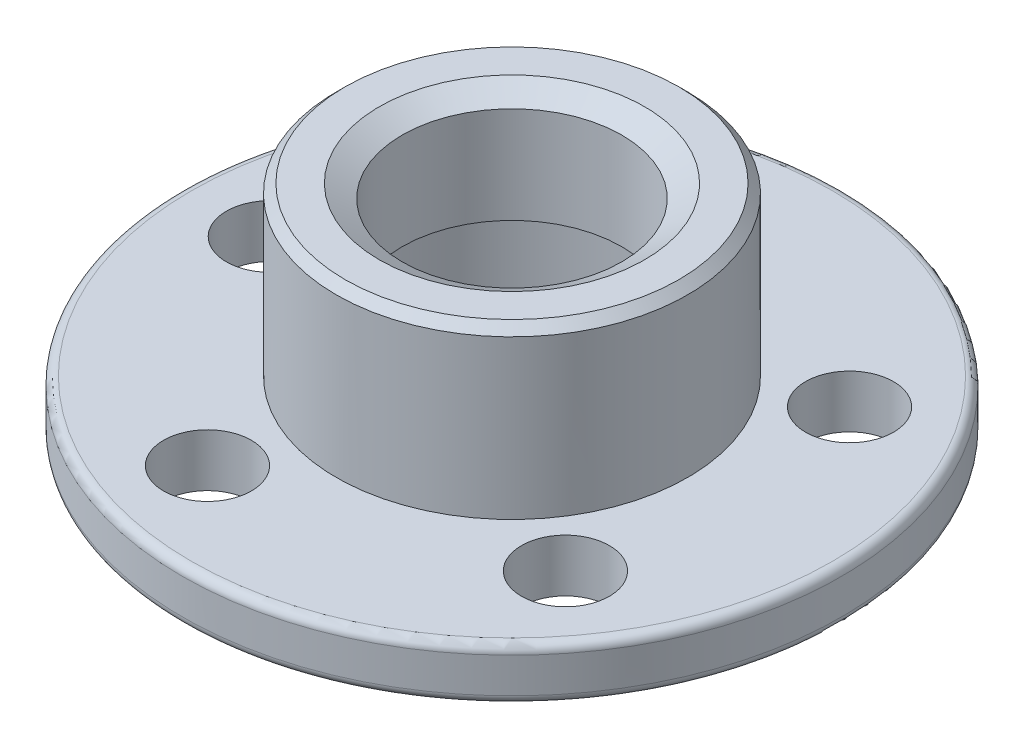
ISO-10303-21;
HEADER;
FILE_DESCRIPTION(('STEP AP214'),'2;1');
FILE_NAME('part.step','',(''),(''),'','','');
FILE_SCHEMA(('AUTOMOTIVE_DESIGN { 1 0 10303 214 1 1 1 1 }'));
ENDSEC;
DATA;
#1=APPLICATION_CONTEXT('core data for automotive mechanical design processes');
#2=APPLICATION_PROTOCOL_DEFINITION('international standard','automotive_design',2000,#1);
#3=PRODUCT_CONTEXT('',#1,'mechanical');
#4=PRODUCT('Part','Part','',(#3));
#5=PRODUCT_RELATED_PRODUCT_CATEGORY('part','',(#4));
#6=PRODUCT_DEFINITION_FORMATION('','',#4);
#7=PRODUCT_DEFINITION_CONTEXT('part definition',#1,'design');
#8=PRODUCT_DEFINITION('design','',#6,#7);
#9=PRODUCT_DEFINITION_SHAPE('','',#8);
#10=(LENGTH_UNIT() NAMED_UNIT(*) SI_UNIT(.MILLI.,.METRE.));
#11=(NAMED_UNIT(*) PLANE_ANGLE_UNIT() SI_UNIT($,.RADIAN.));
#12=(NAMED_UNIT(*) SI_UNIT($,.STERADIAN.) SOLID_ANGLE_UNIT());
#13=UNCERTAINTY_MEASURE_WITH_UNIT(LENGTH_MEASURE(1.E-05),#10,'distance_accuracy_value','');
#14=(GEOMETRIC_REPRESENTATION_CONTEXT(3) GLOBAL_UNCERTAINTY_ASSIGNED_CONTEXT((#13)) GLOBAL_UNIT_ASSIGNED_CONTEXT((#10,
#11,#12)) REPRESENTATION_CONTEXT('',''));
#15=CARTESIAN_POINT('',(0.,0.,0.));
#16=DIRECTION('',(0.,0.,1.));
#17=DIRECTION('',(1.,0.,0.));
#18=AXIS2_PLACEMENT_3D('',#15,#16,#17);
#19=CARTESIAN_POINT('',(0.,0.,0.));
#20=DIRECTION('',(0.,-1.,0.));
#21=DIRECTION('',(0.,0.,-1.));
#22=AXIS2_PLACEMENT_3D('',#19,#20,#21);
#23=CYLINDRICAL_SURFACE('',#22,35.);
#24=CARTESIAN_POINT('',(0.,0.,0.));
#25=DIRECTION('',(0.,-1.,0.));
#26=DIRECTION('',(0.,0.,-1.));
#27=AXIS2_PLACEMENT_3D('',#24,#25,#26);
#28=CIRCLE('',#27,35.);
#29=CARTESIAN_POINT('',(0.,0.,-35.));
#30=VERTEX_POINT('',#29);
#31=EDGE_CURVE('E80',#30,#30,#28,.T.);
#32=ORIENTED_EDGE('',*,*,#31,.T.);
#33=EDGE_LOOP('',(#32));
#34=FACE_BOUND('',#33,.T.);
#35=CARTESIAN_POINT('',(0.,25.,0.));
#36=DIRECTION('',(0.,-1.,0.));
#37=DIRECTION('',(0.,0.,-1.));
#38=AXIS2_PLACEMENT_3D('',#35,#36,#37);
#39=CIRCLE('',#38,35.);
#40=CARTESIAN_POINT('',(0.,25.,-35.));
#41=VERTEX_POINT('',#40);
#42=EDGE_CURVE('E92',#41,#41,#39,.T.);
#43=ORIENTED_EDGE('',*,*,#42,.F.);
#44=EDGE_LOOP('',(#43));
#45=FACE_BOUND('',#44,.T.);
#46=ADVANCED_FACE('F39',(#34,#45),#23,.F.);
#47=CARTESIAN_POINT('',(35.,0.,0.));
#48=DIRECTION('',(0.,-1.,0.));
#49=DIRECTION('',(0.,0.,-1.));
#50=AXIS2_PLACEMENT_3D('',#47,#48,#49);
#51=PLANE('',#50);
#52=CARTESIAN_POINT('',(0.,0.,0.));
#53=DIRECTION('',(0.,-1.,0.));
#54=DIRECTION('',(0.,0.,-1.));
#55=AXIS2_PLACEMENT_3D('',#52,#53,#54);
#56=CIRCLE('',#55,73.);
#57=CARTESIAN_POINT('',(0.,0.,-73.));
#58=VERTEX_POINT('',#57);
#59=EDGE_CURVE('E76',#58,#58,#56,.T.);
#60=ORIENTED_EDGE('',*,*,#59,.T.);
#61=EDGE_LOOP('',(#60));
#62=FACE_BOUND('',#61,.T.);
#63=CARTESIAN_POINT('',(-16.9959346906227,0.,52.3081083962333));
#64=DIRECTION('',(0.,-1.,0.));
#65=DIRECTION('',(-0.95105651629515,0.,-0.309016994374958));
#66=AXIS2_PLACEMENT_3D('',#63,#64,#65);
#67=CIRCLE('',#66,10.);
#68=CARTESIAN_POINT('',(-26.5064998535742,0.,49.2179384524837));
#69=VERTEX_POINT('',#68);
#70=EDGE_CURVE('E118',#69,#69,#67,.T.);
#71=ORIENTED_EDGE('',*,*,#70,.F.);
#72=EDGE_LOOP('',(#71));
#73=FACE_BOUND('',#72,.T.);
#74=CARTESIAN_POINT('',(44.4959346906218,0.,32.3281888760864));
#75=DIRECTION('',(0.,-1.,0.));
#76=DIRECTION('',(-0.58778525229248,0.,0.809016994374942));
#77=AXIS2_PLACEMENT_3D('',#74,#75,#76);
#78=CIRCLE('',#77,10.);
#79=CARTESIAN_POINT('',(38.618082167697,0.,40.4183588198358));
#80=VERTEX_POINT('',#79);
#81=EDGE_CURVE('E117',#80,#80,#78,.T.);
#82=ORIENTED_EDGE('',*,*,#81,.F.);
#83=EDGE_LOOP('',(#82));
#84=FACE_BOUND('',#83,.T.);
#85=CARTESIAN_POINT('',(44.4959346906223,0.,-32.3281888760858));
#86=DIRECTION('',(0.,-1.,0.));
#87=DIRECTION('',(0.587785252292469,0.,0.809016994374951));
#88=AXIS2_PLACEMENT_3D('',#85,#86,#87);
#89=CIRCLE('',#88,10.);
#90=CARTESIAN_POINT('',(50.373787213547,0.,-24.2380189323363));
#91=VERTEX_POINT('',#90);
#92=EDGE_CURVE('E126',#91,#91,#89,.T.);
#93=ORIENTED_EDGE('',*,*,#92,.F.);
#94=EDGE_LOOP('',(#93));
#95=FACE_BOUND('',#94,.T.);
#96=CARTESIAN_POINT('',(-16.995934690622,0.,-52.3081083962335));
#97=DIRECTION('',(0.,-1.,0.));
#98=DIRECTION('',(0.951056516295155,0.,-0.309016994374945));
#99=AXIS2_PLACEMENT_3D('',#96,#97,#98);
#100=CIRCLE('',#99,10.);
#101=CARTESIAN_POINT('',(-7.48536952767041,0.,-55.398278339983));
#102=VERTEX_POINT('',#101);
#103=EDGE_CURVE('E108',#102,#102,#100,.T.);
#104=ORIENTED_EDGE('',*,*,#103,.F.);
#105=EDGE_LOOP('',(#104));
#106=FACE_BOUND('',#105,.T.);
#107=CARTESIAN_POINT('',(-55.,0.,0.));
#108=DIRECTION('',(0.,-1.,0.));
#109=DIRECTION('',(0.,0.,-1.));
#110=AXIS2_PLACEMENT_3D('',#107,#108,#109);
#111=CIRCLE('',#110,10.);
#112=CARTESIAN_POINT('',(-55.,0.,-10.));
#113=VERTEX_POINT('',#112);
#114=EDGE_CURVE('E96',#113,#113,#111,.T.);
#115=ORIENTED_EDGE('',*,*,#114,.F.);
#116=EDGE_LOOP('',(#115));
#117=FACE_BOUND('',#116,.T.);
#118=ORIENTED_EDGE('',*,*,#31,.F.);
#119=EDGE_LOOP('',(#118));
#120=FACE_BOUND('',#119,.T.);
#121=ADVANCED_FACE('F140',(#62,#73,#84,#95,#106,#117,#120),#51,.T.);
#122=CARTESIAN_POINT('',(0.,0.,0.));
#123=DIRECTION('',(0.,-1.,0.));
#124=DIRECTION('',(0.,0.,-1.));
#125=AXIS2_PLACEMENT_3D('',#122,#123,#124);
#126=CYLINDRICAL_SURFACE('',#125,75.);
#127=CARTESIAN_POINT('',(0.,2.,0.));
#128=DIRECTION('',(0.,-1.,0.));
#129=DIRECTION('',(0.,0.,-1.));
#130=AXIS2_PLACEMENT_3D('',#127,#128,#129);
#131=CIRCLE('',#130,75.);
#132=CARTESIAN_POINT('',(0.,2.,-75.));
#133=VERTEX_POINT('',#132);
#134=EDGE_CURVE('E68',#133,#133,#131,.F.);
#135=ORIENTED_EDGE('',*,*,#134,.T.);
#136=EDGE_LOOP('',(#135));
#137=FACE_BOUND('',#136,.T.);
#138=CARTESIAN_POINT('',(0.,10.,0.));
#139=DIRECTION('',(0.,1.,0.));
#140=DIRECTION('',(0.,0.,1.));
#141=AXIS2_PLACEMENT_3D('',#138,#139,#140);
#142=CIRCLE('',#141,75.);
#143=CARTESIAN_POINT('',(0.,10.,75.));
#144=VERTEX_POINT('',#143);
#145=EDGE_CURVE('E72',#144,#144,#142,.F.);
#146=ORIENTED_EDGE('',*,*,#145,.T.);
#147=EDGE_LOOP('',(#146));
#148=FACE_BOUND('',#147,.T.);
#149=ADVANCED_FACE('F143',(#137,#148),#126,.T.);
#150=CARTESIAN_POINT('',(75.,12.,0.));
#151=DIRECTION('',(0.,1.,0.));
#152=DIRECTION('',(0.,0.,1.));
#153=AXIS2_PLACEMENT_3D('',#150,#151,#152);
#154=PLANE('',#153);
#155=CARTESIAN_POINT('',(0.,12.,0.));
#156=DIRECTION('',(0.,1.,0.));
#157=DIRECTION('',(0.,0.,1.));
#158=AXIS2_PLACEMENT_3D('',#155,#156,#157);
#159=CIRCLE('',#158,73.);
#160=CARTESIAN_POINT('',(0.,12.,73.));
#161=VERTEX_POINT('',#160);
#162=EDGE_CURVE('E64',#161,#161,#159,.T.);
#163=ORIENTED_EDGE('',*,*,#162,.T.);
#164=EDGE_LOOP('',(#163));
#165=FACE_BOUND('',#164,.T.);
#166=CARTESIAN_POINT('',(-16.9959346906227,12.,52.3081083962333));
#167=DIRECTION('',(0.,-1.,0.));
#168=DIRECTION('',(-0.95105651629515,0.,-0.309016994374958));
#169=AXIS2_PLACEMENT_3D('',#166,#167,#168);
#170=CIRCLE('',#169,10.);
#171=CARTESIAN_POINT('',(-26.5064998535742,12.,49.2179384524837));
#172=VERTEX_POINT('',#171);
#173=EDGE_CURVE('E113',#172,#172,#170,.T.);
#174=ORIENTED_EDGE('',*,*,#173,.T.);
#175=EDGE_LOOP('',(#174));
#176=FACE_BOUND('',#175,.T.);
#177=CARTESIAN_POINT('',(44.4959346906218,12.,32.3281888760864));
#178=DIRECTION('',(0.,-1.,0.));
#179=DIRECTION('',(-0.58778525229248,0.,0.809016994374942));
#180=AXIS2_PLACEMENT_3D('',#177,#178,#179);
#181=CIRCLE('',#180,10.);
#182=CARTESIAN_POINT('',(38.618082167697,12.,40.4183588198358));
#183=VERTEX_POINT('',#182);
#184=EDGE_CURVE('E122',#183,#183,#181,.T.);
#185=ORIENTED_EDGE('',*,*,#184,.T.);
#186=EDGE_LOOP('',(#185));
#187=FACE_BOUND('',#186,.T.);
#188=CARTESIAN_POINT('',(44.4959346906223,12.,-32.3281888760858));
#189=DIRECTION('',(0.,-1.,0.));
#190=DIRECTION('',(0.587785252292469,0.,0.809016994374951));
#191=AXIS2_PLACEMENT_3D('',#188,#189,#190);
#192=CIRCLE('',#191,10.);
#193=CARTESIAN_POINT('',(50.373787213547,12.,-24.2380189323363));
#194=VERTEX_POINT('',#193);
#195=EDGE_CURVE('E112',#194,#194,#192,.T.);
#196=ORIENTED_EDGE('',*,*,#195,.T.);
#197=EDGE_LOOP('',(#196));
#198=FACE_BOUND('',#197,.T.);
#199=CARTESIAN_POINT('',(-16.995934690622,12.,-52.3081083962335));
#200=DIRECTION('',(0.,-1.,0.));
#201=DIRECTION('',(0.951056516295155,0.,-0.309016994374945));
#202=AXIS2_PLACEMENT_3D('',#199,#200,#201);
#203=CIRCLE('',#202,10.);
#204=CARTESIAN_POINT('',(-7.48536952767041,12.,-55.398278339983));
#205=VERTEX_POINT('',#204);
#206=EDGE_CURVE('E104',#205,#205,#203,.T.);
#207=ORIENTED_EDGE('',*,*,#206,.T.);
#208=EDGE_LOOP('',(#207));
#209=FACE_BOUND('',#208,.T.);
#210=CARTESIAN_POINT('',(-55.,12.,0.));
#211=DIRECTION('',(0.,-1.,0.));
#212=DIRECTION('',(0.,0.,-1.));
#213=AXIS2_PLACEMENT_3D('',#210,#211,#212);
#214=CIRCLE('',#213,10.);
#215=CARTESIAN_POINT('',(-55.,12.,-10.));
#216=VERTEX_POINT('',#215);
#217=EDGE_CURVE('E100',#216,#216,#214,.T.);
#218=ORIENTED_EDGE('',*,*,#217,.T.);
#219=EDGE_LOOP('',(#218));
#220=FACE_BOUND('',#219,.T.);
#221=CARTESIAN_POINT('',(0.,12.,0.));
#222=DIRECTION('',(0.,-1.,0.));
#223=DIRECTION('',(0.,0.,-1.));
#224=AXIS2_PLACEMENT_3D('',#221,#222,#223);
#225=CIRCLE('',#224,40.);
#226=CARTESIAN_POINT('',(0.,12.,-40.));
#227=VERTEX_POINT('',#226);
#228=EDGE_CURVE('E84',#227,#227,#225,.T.);
#229=ORIENTED_EDGE('',*,*,#228,.T.);
#230=EDGE_LOOP('',(#229));
#231=FACE_BOUND('',#230,.T.);
#232=ADVANCED_FACE('F177',(#165,#176,#187,#198,#209,#220,#231),#154,.T.);
#233=CARTESIAN_POINT('',(0.,0.,0.));
#234=DIRECTION('',(0.,-1.,0.));
#235=DIRECTION('',(0.,0.,-1.));
#236=AXIS2_PLACEMENT_3D('',#233,#234,#235);
#237=CYLINDRICAL_SURFACE('',#236,40.);
#238=CARTESIAN_POINT('',(0.,48.,0.));
#239=DIRECTION('',(0.,1.,0.));
#240=DIRECTION('',(0.,0.,1.));
#241=AXIS2_PLACEMENT_3D('',#238,#239,#240);
#242=CIRCLE('',#241,40.);
#243=CARTESIAN_POINT('',(0.,48.,40.));
#244=VERTEX_POINT('',#243);
#245=EDGE_CURVE('E58',#244,#244,#242,.F.);
#246=ORIENTED_EDGE('',*,*,#245,.T.);
#247=EDGE_LOOP('',(#246));
#248=FACE_BOUND('',#247,.T.);
#249=ORIENTED_EDGE('',*,*,#228,.F.);
#250=EDGE_LOOP('',(#249));
#251=FACE_BOUND('',#250,.T.);
#252=ADVANCED_FACE('F171',(#248,#251),#237,.T.);
#253=CARTESIAN_POINT('',(40.,50.,0.));
#254=DIRECTION('',(0.,1.,0.));
#255=DIRECTION('',(0.,0.,1.));
#256=AXIS2_PLACEMENT_3D('',#253,#254,#255);
#257=PLANE('',#256);
#258=CARTESIAN_POINT('',(0.,50.,0.));
#259=DIRECTION('',(0.,1.,0.));
#260=DIRECTION('',(0.,0.,1.));
#261=AXIS2_PLACEMENT_3D('',#258,#259,#260);
#262=CIRCLE('',#261,30.1961524227065);
#263=CARTESIAN_POINT('',(0.,50.,30.1961524227065));
#264=VERTEX_POINT('',#263);
#265=EDGE_CURVE('E48',#264,#264,#262,.F.);
#266=ORIENTED_EDGE('',*,*,#265,.T.);
#267=EDGE_LOOP('',(#266));
#268=FACE_BOUND('',#267,.T.);
#269=CARTESIAN_POINT('',(0.,50.,0.));
#270=DIRECTION('',(0.,1.,0.));
#271=DIRECTION('',(0.,0.,1.));
#272=AXIS2_PLACEMENT_3D('',#269,#270,#271);
#273=CIRCLE('',#272,38.);
#274=CARTESIAN_POINT('',(0.,50.,38.));
#275=VERTEX_POINT('',#274);
#276=EDGE_CURVE('E53',#275,#275,#273,.T.);
#277=ORIENTED_EDGE('',*,*,#276,.T.);
#278=EDGE_LOOP('',(#277));
#279=FACE_BOUND('',#278,.T.);
#280=ADVANCED_FACE('F166',(#268,#279),#257,.T.);
#281=CARTESIAN_POINT('',(0.,0.,0.));
#282=DIRECTION('',(0.,-1.,0.));
#283=DIRECTION('',(0.,0.,-1.));
#284=AXIS2_PLACEMENT_3D('',#281,#282,#283);
#285=CYLINDRICAL_SURFACE('',#284,25.);
#286=CARTESIAN_POINT('',(0.,47.,0.));
#287=DIRECTION('',(0.,1.,0.));
#288=DIRECTION('',(0.,0.,1.));
#289=AXIS2_PLACEMENT_3D('',#286,#287,#288);
#290=CIRCLE('',#289,25.);
#291=CARTESIAN_POINT('',(0.,47.,25.));
#292=VERTEX_POINT('',#291);
#293=EDGE_CURVE('E10',#292,#292,#290,.T.);
#294=ORIENTED_EDGE('',*,*,#293,.T.);
#295=EDGE_LOOP('',(#294));
#296=FACE_BOUND('',#295,.T.);
#297=CARTESIAN_POINT('',(0.,25.,0.));
#298=DIRECTION('',(0.,-1.,0.));
#299=DIRECTION('',(0.,0.,-1.));
#300=AXIS2_PLACEMENT_3D('',#297,#298,#299);
#301=CIRCLE('',#300,25.);
#302=CARTESIAN_POINT('',(0.,25.,-25.));
#303=VERTEX_POINT('',#302);
#304=EDGE_CURVE('E88',#303,#303,#301,.T.);
#305=ORIENTED_EDGE('',*,*,#304,.T.);
#306=EDGE_LOOP('',(#305));
#307=FACE_BOUND('',#306,.T.);
#308=ADVANCED_FACE('F161',(#296,#307),#285,.F.);
#309=CARTESIAN_POINT('',(25.,25.,0.));
#310=DIRECTION('',(0.,-1.,0.));
#311=DIRECTION('',(0.,0.,-1.));
#312=AXIS2_PLACEMENT_3D('',#309,#310,#311);
#313=PLANE('',#312);
#314=ORIENTED_EDGE('',*,*,#42,.T.);
#315=EDGE_LOOP('',(#314));
#316=FACE_BOUND('',#315,.T.);
#317=ORIENTED_EDGE('',*,*,#304,.F.);
#318=EDGE_LOOP('',(#317));
#319=FACE_BOUND('',#318,.T.);
#320=ADVANCED_FACE('F157',(#316,#319),#313,.T.);
#321=CARTESIAN_POINT('',(-55.,-2.97614430781756,0.));
#322=DIRECTION('',(0.,-1.,0.));
#323=DIRECTION('',(0.,0.,-1.));
#324=AXIS2_PLACEMENT_3D('',#321,#322,#323);
#325=CYLINDRICAL_SURFACE('',#324,10.);
#326=ORIENTED_EDGE('',*,*,#114,.T.);
#327=EDGE_LOOP('',(#326));
#328=FACE_BOUND('',#327,.T.);
#329=ORIENTED_EDGE('',*,*,#217,.F.);
#330=EDGE_LOOP('',(#329));
#331=FACE_BOUND('',#330,.T.);
#332=ADVANCED_FACE('F160',(#328,#331),#325,.F.);
#333=CARTESIAN_POINT('',(-16.995934690622,-2.97614430781756,-52.3081083962335));
#334=DIRECTION('',(0.,-1.,0.));
#335=DIRECTION('',(0.951056516295155,0.,-0.309016994374945));
#336=AXIS2_PLACEMENT_3D('',#333,#334,#335);
#337=CYLINDRICAL_SURFACE('',#336,10.);
#338=ORIENTED_EDGE('',*,*,#103,.T.);
#339=EDGE_LOOP('',(#338));
#340=FACE_BOUND('',#339,.T.);
#341=ORIENTED_EDGE('',*,*,#206,.F.);
#342=EDGE_LOOP('',(#341));
#343=FACE_BOUND('',#342,.T.);
#344=ADVANCED_FACE('F293',(#340,#343),#337,.F.);
#345=CARTESIAN_POINT('',(44.4959346906223,-2.97614430781756,-32.3281888760858));
#346=DIRECTION('',(0.,-1.,0.));
#347=DIRECTION('',(0.587785252292469,0.,0.809016994374951));
#348=AXIS2_PLACEMENT_3D('',#345,#346,#347);
#349=CYLINDRICAL_SURFACE('',#348,10.);
#350=ORIENTED_EDGE('',*,*,#92,.T.);
#351=EDGE_LOOP('',(#350));
#352=FACE_BOUND('',#351,.T.);
#353=ORIENTED_EDGE('',*,*,#195,.F.);
#354=EDGE_LOOP('',(#353));
#355=FACE_BOUND('',#354,.T.);
#356=ADVANCED_FACE('F137',(#352,#355),#349,.F.);
#357=CARTESIAN_POINT('',(44.4959346906218,-2.97614430781756,32.3281888760864));
#358=DIRECTION('',(0.,-1.,0.));
#359=DIRECTION('',(-0.58778525229248,0.,0.809016994374942));
#360=AXIS2_PLACEMENT_3D('',#357,#358,#359);
#361=CYLINDRICAL_SURFACE('',#360,10.);
#362=ORIENTED_EDGE('',*,*,#81,.T.);
#363=EDGE_LOOP('',(#362));
#364=FACE_BOUND('',#363,.T.);
#365=ORIENTED_EDGE('',*,*,#184,.F.);
#366=EDGE_LOOP('',(#365));
#367=FACE_BOUND('',#366,.T.);
#368=ADVANCED_FACE('F274',(#364,#367),#361,.F.);
#369=CARTESIAN_POINT('',(-16.9959346906227,-2.97614430781756,52.3081083962333));
#370=DIRECTION('',(0.,-1.,0.));
#371=DIRECTION('',(-0.95105651629515,0.,-0.309016994374958));
#372=AXIS2_PLACEMENT_3D('',#369,#370,#371);
#373=CYLINDRICAL_SURFACE('',#372,10.);
#374=ORIENTED_EDGE('',*,*,#70,.T.);
#375=EDGE_LOOP('',(#374));
#376=FACE_BOUND('',#375,.T.);
#377=ORIENTED_EDGE('',*,*,#173,.F.);
#378=EDGE_LOOP('',(#377));
#379=FACE_BOUND('',#378,.T.);
#380=ADVANCED_FACE('F189',(#376,#379),#373,.F.);
#381=CARTESIAN_POINT('',(0.,2.,0.));
#382=DIRECTION('',(0.,-1.,0.));
#383=DIRECTION('',(0.,0.,-1.));
#384=AXIS2_PLACEMENT_3D('',#381,#382,#383);
#385=TOROIDAL_SURFACE('',#384,73.,2.);
#386=ORIENTED_EDGE('',*,*,#134,.F.);
#387=EDGE_LOOP('',(#386));
#388=FACE_BOUND('',#387,.T.);
#389=ORIENTED_EDGE('',*,*,#59,.F.);
#390=EDGE_LOOP('',(#389));
#391=FACE_BOUND('',#390,.T.);
#392=ADVANCED_FACE('F185',(#388,#391),#385,.T.);
#393=CARTESIAN_POINT('',(0.,10.,0.));
#394=DIRECTION('',(0.,1.,0.));
#395=DIRECTION('',(0.,0.,1.));
#396=AXIS2_PLACEMENT_3D('',#393,#394,#395);
#397=TOROIDAL_SURFACE('',#396,73.,2.);
#398=ORIENTED_EDGE('',*,*,#162,.F.);
#399=EDGE_LOOP('',(#398));
#400=FACE_BOUND('',#399,.T.);
#401=ORIENTED_EDGE('',*,*,#145,.F.);
#402=EDGE_LOOP('',(#401));
#403=FACE_BOUND('',#402,.T.);
#404=ADVANCED_FACE('F188',(#400,#403),#397,.T.);
#405=CARTESIAN_POINT('',(0.,48.,0.));
#406=DIRECTION('',(0.,-1.,0.));
#407=DIRECTION('',(0.,0.,-1.));
#408=AXIS2_PLACEMENT_3D('',#405,#406,#407);
#409=CONICAL_SURFACE('',#408,40.,0.785398163397452);
#410=ORIENTED_EDGE('',*,*,#276,.F.);
#411=EDGE_LOOP('',(#410));
#412=FACE_BOUND('',#411,.T.);
#413=ORIENTED_EDGE('',*,*,#245,.F.);
#414=EDGE_LOOP('',(#413));
#415=FACE_BOUND('',#414,.T.);
#416=ADVANCED_FACE('F192',(#412,#415),#409,.T.);
#417=CARTESIAN_POINT('',(0.,50.,0.));
#418=DIRECTION('',(0.,1.,0.));
#419=DIRECTION('',(0.,0.,1.));
#420=AXIS2_PLACEMENT_3D('',#417,#418,#419);
#421=CONICAL_SURFACE('',#420,30.1961524227065,1.04719755119659);
#422=ORIENTED_EDGE('',*,*,#293,.F.);
#423=EDGE_LOOP('',(#422));
#424=FACE_BOUND('',#423,.T.);
#425=ORIENTED_EDGE('',*,*,#265,.F.);
#426=EDGE_LOOP('',(#425));
#427=FACE_BOUND('',#426,.T.);
#428=ADVANCED_FACE('F42',(#424,#427),#421,.F.);
#429=CLOSED_SHELL('',(#46,#121,#149,#232,#252,#280,#308,#320,#332,#344,#356,#368,#380,#392,#404,
#416,#428));
#430=MANIFOLD_SOLID_BREP('B2',#429);
#431=ADVANCED_BREP_SHAPE_REPRESENTATION('',(#18,#430),#14);
#432=SHAPE_DEFINITION_REPRESENTATION(#9,#431);
ENDSEC;
END-ISO-10303-21;
